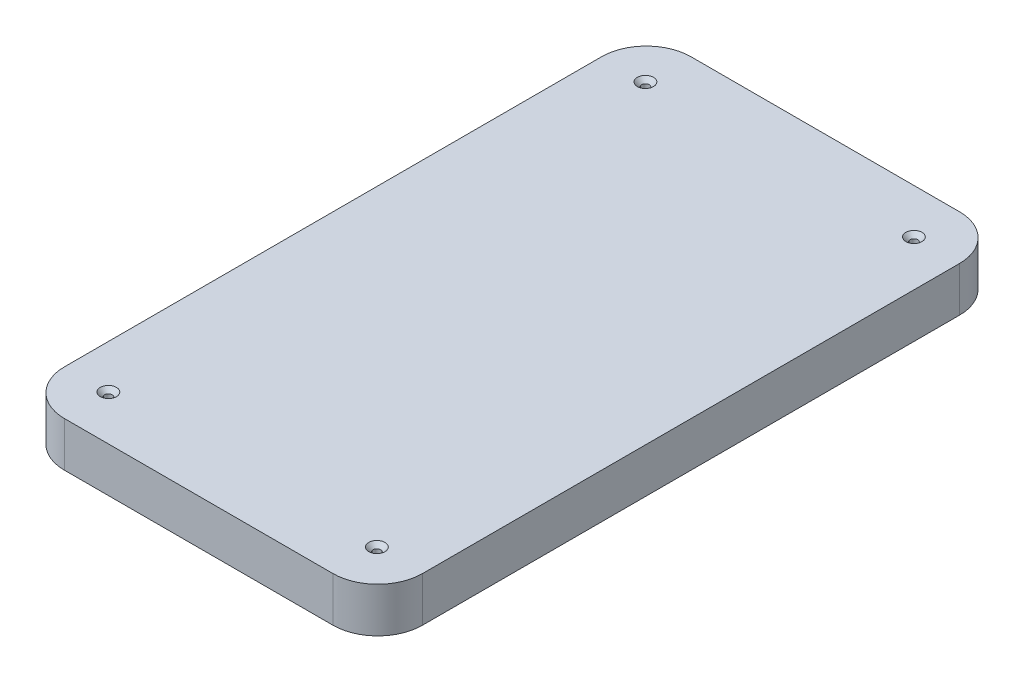
ISO-10303-21;
HEADER;
FILE_DESCRIPTION(('STEP AP214'),'2;1');
FILE_NAME('part.step','',(''),(''),'','','');
FILE_SCHEMA(('AUTOMOTIVE_DESIGN { 1 0 10303 214 1 1 1 1 }'));
ENDSEC;
DATA;
#1=APPLICATION_CONTEXT('core data for automotive mechanical design processes');
#2=APPLICATION_PROTOCOL_DEFINITION('international standard','automotive_design',2000,#1);
#3=PRODUCT_CONTEXT('',#1,'mechanical');
#4=PRODUCT('Part','Part','',(#3));
#5=PRODUCT_RELATED_PRODUCT_CATEGORY('part','',(#4));
#6=PRODUCT_DEFINITION_FORMATION('','',#4);
#7=PRODUCT_DEFINITION_CONTEXT('part definition',#1,'design');
#8=PRODUCT_DEFINITION('design','',#6,#7);
#9=PRODUCT_DEFINITION_SHAPE('','',#8);
#10=(LENGTH_UNIT() NAMED_UNIT(*) SI_UNIT(.MILLI.,.METRE.));
#11=(NAMED_UNIT(*) PLANE_ANGLE_UNIT() SI_UNIT($,.RADIAN.));
#12=(NAMED_UNIT(*) SI_UNIT($,.STERADIAN.) SOLID_ANGLE_UNIT());
#13=UNCERTAINTY_MEASURE_WITH_UNIT(LENGTH_MEASURE(1.E-05),#10,'distance_accuracy_value','');
#14=(GEOMETRIC_REPRESENTATION_CONTEXT(3) GLOBAL_UNCERTAINTY_ASSIGNED_CONTEXT((#13)) GLOBAL_UNIT_ASSIGNED_CONTEXT((#10,
#11,#12)) REPRESENTATION_CONTEXT('',''));
#15=CARTESIAN_POINT('',(0.,0.,0.));
#16=DIRECTION('',(0.,0.,1.));
#17=DIRECTION('',(1.,0.,0.));
#18=AXIS2_PLACEMENT_3D('',#15,#16,#17);
#19=CARTESIAN_POINT('',(0.,0.,0.));
#20=DIRECTION('',(0.,-1.,0.));
#21=DIRECTION('',(0.,0.,-1.));
#22=AXIS2_PLACEMENT_3D('',#19,#20,#21);
#23=PLANE('',#22);
#24=CARTESIAN_POINT('',(-30.2163328764187,0.,-60.0284298133967));
#25=DIRECTION('',(0.,1.,0.));
#26=DIRECTION('',(0.,0.,1.));
#27=AXIS2_PLACEMENT_3D('',#24,#25,#26);
#28=CIRCLE('',#27,0.849999999999986);
#29=CARTESIAN_POINT('',(-30.2163328764187,0.,-59.1784298133967));
#30=VERTEX_POINT('',#29);
#31=EDGE_CURVE('E793',#30,#30,#28,.T.);
#32=ORIENTED_EDGE('',*,*,#31,.T.);
#33=EDGE_LOOP('',(#32));
#34=FACE_BOUND('',#33,.T.);
#35=CARTESIAN_POINT('',(29.7723509773767,0.,-60.0284298133967));
#36=DIRECTION('',(0.,1.,0.));
#37=DIRECTION('',(0.,0.,1.));
#38=AXIS2_PLACEMENT_3D('',#35,#36,#37);
#39=CIRCLE('',#38,0.849999999999986);
#40=CARTESIAN_POINT('',(29.7723509773767,0.,-59.1784298133967));
#41=VERTEX_POINT('',#40);
#42=EDGE_CURVE('E806',#41,#41,#39,.T.);
#43=ORIENTED_EDGE('',*,*,#42,.T.);
#44=EDGE_LOOP('',(#43));
#45=FACE_BOUND('',#44,.T.);
#46=CARTESIAN_POINT('',(29.7723509773767,0.,59.9579094354149));
#47=DIRECTION('',(0.,1.,0.));
#48=DIRECTION('',(0.,0.,1.));
#49=AXIS2_PLACEMENT_3D('',#46,#47,#48);
#50=CIRCLE('',#49,0.849999999999986);
#51=CARTESIAN_POINT('',(29.7723509773767,0.,60.8079094354149));
#52=VERTEX_POINT('',#51);
#53=EDGE_CURVE('E818',#52,#52,#50,.T.);
#54=ORIENTED_EDGE('',*,*,#53,.T.);
#55=EDGE_LOOP('',(#54));
#56=FACE_BOUND('',#55,.T.);
#57=DIRECTION('',(0.,0.,1.));
#58=VECTOR('',#57,1.);
#59=CARTESIAN_POINT('',(-40.,0.,70.));
#60=LINE('',#59,#58);
#61=CARTESIAN_POINT('',(-40.,0.,-60.));
#62=VERTEX_POINT('',#61);
#63=CARTESIAN_POINT('',(-40.,0.,60.));
#64=VERTEX_POINT('',#63);
#65=EDGE_CURVE('E403',#62,#64,#60,.T.);
#66=ORIENTED_EDGE('',*,*,#65,.F.);
#67=CARTESIAN_POINT('',(-30.,0.,-60.));
#68=DIRECTION('',(0.,-1.,0.));
#69=DIRECTION('',(0.,0.,-1.));
#70=AXIS2_PLACEMENT_3D('',#67,#68,#69);
#71=CIRCLE('',#70,10.);
#72=CARTESIAN_POINT('',(-30.,0.,-70.));
#73=VERTEX_POINT('',#72);
#74=EDGE_CURVE('E424',#62,#73,#71,.T.);
#75=ORIENTED_EDGE('',*,*,#74,.T.);
#76=DIRECTION('',(-1.,0.,0.));
#77=VECTOR('',#76,1.);
#78=CARTESIAN_POINT('',(-40.,0.,-70.));
#79=LINE('',#78,#77);
#80=CARTESIAN_POINT('',(30.,0.,-70.));
#81=VERTEX_POINT('',#80);
#82=EDGE_CURVE('E399',#81,#73,#79,.T.);
#83=ORIENTED_EDGE('',*,*,#82,.F.);
#84=CARTESIAN_POINT('',(30.,0.,-60.));
#85=DIRECTION('',(0.,-1.,0.));
#86=DIRECTION('',(0.,0.,-1.));
#87=AXIS2_PLACEMENT_3D('',#84,#85,#86);
#88=CIRCLE('',#87,10.);
#89=CARTESIAN_POINT('',(40.,0.,-60.));
#90=VERTEX_POINT('',#89);
#91=EDGE_CURVE('E415',#81,#90,#88,.T.);
#92=ORIENTED_EDGE('',*,*,#91,.T.);
#93=DIRECTION('',(0.,0.,-1.));
#94=VECTOR('',#93,1.);
#95=CARTESIAN_POINT('',(40.,0.,70.));
#96=LINE('',#95,#94);
#97=CARTESIAN_POINT('',(40.,0.,60.));
#98=VERTEX_POINT('',#97);
#99=EDGE_CURVE('E366',#98,#90,#96,.T.);
#100=ORIENTED_EDGE('',*,*,#99,.F.);
#101=CARTESIAN_POINT('',(30.,0.,60.));
#102=DIRECTION('',(0.,-1.,0.));
#103=DIRECTION('',(0.,0.,-1.));
#104=AXIS2_PLACEMENT_3D('',#101,#102,#103);
#105=CIRCLE('',#104,10.);
#106=CARTESIAN_POINT('',(30.,0.,70.));
#107=VERTEX_POINT('',#106);
#108=EDGE_CURVE('E418',#98,#107,#105,.T.);
#109=ORIENTED_EDGE('',*,*,#108,.T.);
#110=DIRECTION('',(1.,0.,0.));
#111=VECTOR('',#110,1.);
#112=CARTESIAN_POINT('',(-40.,0.,70.));
#113=LINE('',#112,#111);
#114=CARTESIAN_POINT('',(-30.,0.,70.));
#115=VERTEX_POINT('',#114);
#116=EDGE_CURVE('E385',#115,#107,#113,.T.);
#117=ORIENTED_EDGE('',*,*,#116,.F.);
#118=CARTESIAN_POINT('',(-30.,0.,60.));
#119=DIRECTION('',(0.,-1.,0.));
#120=DIRECTION('',(0.,0.,-1.));
#121=AXIS2_PLACEMENT_3D('',#118,#119,#120);
#122=CIRCLE('',#121,10.);
#123=EDGE_CURVE('E421',#115,#64,#122,.T.);
#124=ORIENTED_EDGE('',*,*,#123,.T.);
#125=EDGE_LOOP('',(#66,#75,#83,#92,#100,#109,#117,#124));
#126=FACE_BOUND('',#125,.T.);
#127=DIRECTION('',(-1.,0.,0.));
#128=VECTOR('',#127,1.);
#129=CARTESIAN_POINT('',(0.,0.,-65.));
#130=LINE('',#129,#128);
#131=CARTESIAN_POINT('',(25.,0.,-65.));
#132=VERTEX_POINT('',#131);
#133=CARTESIAN_POINT('',(-25.,0.,-65.));
#134=VERTEX_POINT('',#133);
#135=EDGE_CURVE('E370',#132,#134,#130,.T.);
#136=ORIENTED_EDGE('',*,*,#135,.T.);
#137=DIRECTION('',(0.,0.,1.));
#138=VECTOR('',#137,1.);
#139=CARTESIAN_POINT('',(-25.,0.,-60.));
#140=LINE('',#139,#138);
#141=CARTESIAN_POINT('',(-25.,0.,-60.));
#142=VERTEX_POINT('',#141);
#143=EDGE_CURVE('E834',#134,#142,#140,.T.);
#144=ORIENTED_EDGE('',*,*,#143,.T.);
#145=CARTESIAN_POINT('',(-30.,0.,-60.));
#146=DIRECTION('',(0.,-1.,0.));
#147=DIRECTION('',(0.,0.,1.));
#148=AXIS2_PLACEMENT_3D('',#145,#146,#147);
#149=CIRCLE('',#148,5.);
#150=CARTESIAN_POINT('',(-30.,0.,-55.));
#151=VERTEX_POINT('',#150);
#152=EDGE_CURVE('E281',#142,#151,#149,.T.);
#153=ORIENTED_EDGE('',*,*,#152,.T.);
#154=DIRECTION('',(-1.,0.,0.));
#155=VECTOR('',#154,1.);
#156=CARTESIAN_POINT('',(-35.,0.,-55.));
#157=LINE('',#156,#155);
#158=CARTESIAN_POINT('',(-35.,0.,-55.));
#159=VERTEX_POINT('',#158);
#160=EDGE_CURVE('E228',#151,#159,#157,.T.);
#161=ORIENTED_EDGE('',*,*,#160,.T.);
#162=DIRECTION('',(0.,0.,1.));
#163=VECTOR('',#162,1.);
#164=CARTESIAN_POINT('',(-35.,0.,0.));
#165=LINE('',#164,#163);
#166=CARTESIAN_POINT('',(-35.,0.,55.));
#167=VERTEX_POINT('',#166);
#168=EDGE_CURVE('E374',#159,#167,#165,.T.);
#169=ORIENTED_EDGE('',*,*,#168,.T.);
#170=DIRECTION('',(1.,0.,0.));
#171=VECTOR('',#170,1.);
#172=CARTESIAN_POINT('',(-30.,0.,55.));
#173=LINE('',#172,#171);
#174=CARTESIAN_POINT('',(-30.,0.,55.));
#175=VERTEX_POINT('',#174);
#176=EDGE_CURVE('E321',#167,#175,#173,.T.);
#177=ORIENTED_EDGE('',*,*,#176,.T.);
#178=CARTESIAN_POINT('',(-30.,0.,60.));
#179=DIRECTION('',(0.,-1.,0.));
#180=DIRECTION('',(0.,0.,-1.));
#181=AXIS2_PLACEMENT_3D('',#178,#179,#180);
#182=CIRCLE('',#181,5.00000000000001);
#183=CARTESIAN_POINT('',(-25.,0.,60.));
#184=VERTEX_POINT('',#183);
#185=EDGE_CURVE('E320',#175,#184,#182,.T.);
#186=ORIENTED_EDGE('',*,*,#185,.T.);
#187=DIRECTION('',(0.,0.,1.));
#188=VECTOR('',#187,1.);
#189=CARTESIAN_POINT('',(-25.,0.,65.));
#190=LINE('',#189,#188);
#191=CARTESIAN_POINT('',(-25.,0.,65.));
#192=VERTEX_POINT('',#191);
#193=EDGE_CURVE('E316',#184,#192,#190,.T.);
#194=ORIENTED_EDGE('',*,*,#193,.T.);
#195=DIRECTION('',(1.,0.,0.));
#196=VECTOR('',#195,1.);
#197=CARTESIAN_POINT('',(0.,0.,65.));
#198=LINE('',#197,#196);
#199=CARTESIAN_POINT('',(25.,0.,65.));
#200=VERTEX_POINT('',#199);
#201=EDGE_CURVE('E356',#192,#200,#198,.T.);
#202=ORIENTED_EDGE('',*,*,#201,.T.);
#203=DIRECTION('',(0.,0.,-1.));
#204=VECTOR('',#203,1.);
#205=CARTESIAN_POINT('',(25.,0.,60.));
#206=LINE('',#205,#204);
#207=CARTESIAN_POINT('',(25.,0.,60.));
#208=VERTEX_POINT('',#207);
#209=EDGE_CURVE('E287',#200,#208,#206,.T.);
#210=ORIENTED_EDGE('',*,*,#209,.T.);
#211=CARTESIAN_POINT('',(30.,0.,60.));
#212=DIRECTION('',(0.,-1.,0.));
#213=DIRECTION('',(0.,0.,-1.));
#214=AXIS2_PLACEMENT_3D('',#211,#212,#213);
#215=CIRCLE('',#214,5.);
#216=CARTESIAN_POINT('',(30.,0.,55.));
#217=VERTEX_POINT('',#216);
#218=EDGE_CURVE('E286',#208,#217,#215,.T.);
#219=ORIENTED_EDGE('',*,*,#218,.T.);
#220=DIRECTION('',(1.,0.,0.));
#221=VECTOR('',#220,1.);
#222=CARTESIAN_POINT('',(35.,0.,55.));
#223=LINE('',#222,#221);
#224=CARTESIAN_POINT('',(35.,0.,55.));
#225=VERTEX_POINT('',#224);
#226=EDGE_CURVE('E282',#217,#225,#223,.T.);
#227=ORIENTED_EDGE('',*,*,#226,.T.);
#228=DIRECTION('',(0.,0.,-1.));
#229=VECTOR('',#228,1.);
#230=CARTESIAN_POINT('',(35.,0.,0.));
#231=LINE('',#230,#229);
#232=CARTESIAN_POINT('',(35.,0.,-55.));
#233=VERTEX_POINT('',#232);
#234=EDGE_CURVE('E329',#225,#233,#231,.T.);
#235=ORIENTED_EDGE('',*,*,#234,.T.);
#236=DIRECTION('',(-1.,0.,0.));
#237=VECTOR('',#236,1.);
#238=CARTESIAN_POINT('',(30.,0.,-55.));
#239=LINE('',#238,#237);
#240=CARTESIAN_POINT('',(30.,0.,-55.));
#241=VERTEX_POINT('',#240);
#242=EDGE_CURVE('E251',#233,#241,#239,.T.);
#243=ORIENTED_EDGE('',*,*,#242,.T.);
#244=CARTESIAN_POINT('',(30.,0.,-60.));
#245=DIRECTION('',(0.,-1.,0.));
#246=DIRECTION('',(0.,0.,1.));
#247=AXIS2_PLACEMENT_3D('',#244,#245,#246);
#248=CIRCLE('',#247,5.);
#249=CARTESIAN_POINT('',(25.,0.,-60.));
#250=VERTEX_POINT('',#249);
#251=EDGE_CURVE('E246',#241,#250,#248,.T.);
#252=ORIENTED_EDGE('',*,*,#251,.T.);
#253=DIRECTION('',(0.,0.,-1.));
#254=VECTOR('',#253,1.);
#255=CARTESIAN_POINT('',(25.,0.,-65.));
#256=LINE('',#255,#254);
#257=EDGE_CURVE('E255',#250,#132,#256,.T.);
#258=ORIENTED_EDGE('',*,*,#257,.T.);
#259=EDGE_LOOP('',(#136,#144,#153,#161,#169,#177,#186,#194,#202,#210,#219,#227,#235,#243,#252,#258));
#260=FACE_BOUND('',#259,.T.);
#261=CARTESIAN_POINT('',(-30.2163328764187,0.,59.9579094354149));
#262=DIRECTION('',(0.,1.,0.));
#263=DIRECTION('',(0.,0.,1.));
#264=AXIS2_PLACEMENT_3D('',#261,#262,#263);
#265=CIRCLE('',#264,0.849999999999986);
#266=CARTESIAN_POINT('',(-30.2163328764187,0.,60.8079094354149));
#267=VERTEX_POINT('',#266);
#268=EDGE_CURVE('E245',#267,#267,#265,.T.);
#269=ORIENTED_EDGE('',*,*,#268,.T.);
#270=EDGE_LOOP('',(#269));
#271=FACE_BOUND('',#270,.T.);
#272=ADVANCED_FACE('F40',(#34,#45,#56,#126,#260,#271),#23,.T.);
#273=CARTESIAN_POINT('',(40.,10.,70.));
#274=DIRECTION('',(-1.,0.,0.));
#275=DIRECTION('',(0.,0.,1.));
#276=AXIS2_PLACEMENT_3D('',#273,#274,#275);
#277=PLANE('',#276);
#278=DIRECTION('',(0.,0.,-1.));
#279=VECTOR('',#278,1.);
#280=CARTESIAN_POINT('',(40.,10.,70.));
#281=LINE('',#280,#279);
#282=CARTESIAN_POINT('',(40.,10.,60.));
#283=VERTEX_POINT('',#282);
#284=CARTESIAN_POINT('',(40.,10.,-60.));
#285=VERTEX_POINT('',#284);
#286=EDGE_CURVE('E380',#283,#285,#281,.T.);
#287=ORIENTED_EDGE('',*,*,#286,.F.);
#288=DIRECTION('',(0.,-1.,0.));
#289=VECTOR('',#288,1.);
#290=CARTESIAN_POINT('',(40.,10.,60.));
#291=LINE('',#290,#289);
#292=EDGE_CURVE('E11',#283,#98,#291,.T.);
#293=ORIENTED_EDGE('',*,*,#292,.T.);
#294=ORIENTED_EDGE('',*,*,#99,.T.);
#295=DIRECTION('',(0.,-1.,0.));
#296=VECTOR('',#295,1.);
#297=CARTESIAN_POINT('',(40.,10.,-60.));
#298=LINE('',#297,#296);
#299=EDGE_CURVE('E49',#90,#285,#298,.F.);
#300=ORIENTED_EDGE('',*,*,#299,.T.);
#301=EDGE_LOOP('',(#287,#293,#294,#300));
#302=FACE_BOUND('',#301,.T.);
#303=ADVANCED_FACE('F454',(#302),#277,.F.);
#304=CARTESIAN_POINT('',(-40.,10.,-70.));
#305=DIRECTION('',(0.,0.,1.));
#306=DIRECTION('',(1.,0.,0.));
#307=AXIS2_PLACEMENT_3D('',#304,#305,#306);
#308=PLANE('',#307);
#309=ORIENTED_EDGE('',*,*,#82,.T.);
#310=DIRECTION('',(0.,-1.,0.));
#311=VECTOR('',#310,1.);
#312=CARTESIAN_POINT('',(-30.,10.,-70.));
#313=LINE('',#312,#311);
#314=CARTESIAN_POINT('',(-30.,10.,-70.));
#315=VERTEX_POINT('',#314);
#316=EDGE_CURVE('E431',#73,#315,#313,.F.);
#317=ORIENTED_EDGE('',*,*,#316,.T.);
#318=DIRECTION('',(-1.,0.,0.));
#319=VECTOR('',#318,1.);
#320=CARTESIAN_POINT('',(-40.,10.,-70.));
#321=LINE('',#320,#319);
#322=CARTESIAN_POINT('',(30.,10.,-70.));
#323=VERTEX_POINT('',#322);
#324=EDGE_CURVE('E384',#323,#315,#321,.T.);
#325=ORIENTED_EDGE('',*,*,#324,.F.);
#326=DIRECTION('',(0.,-1.,0.));
#327=VECTOR('',#326,1.);
#328=CARTESIAN_POINT('',(30.,10.,-70.));
#329=LINE('',#328,#327);
#330=EDGE_CURVE('E427',#323,#81,#329,.T.);
#331=ORIENTED_EDGE('',*,*,#330,.T.);
#332=EDGE_LOOP('',(#309,#317,#325,#331));
#333=FACE_BOUND('',#332,.T.);
#334=ADVANCED_FACE('F465',(#333),#308,.F.);
#335=CARTESIAN_POINT('',(-40.,10.,70.));
#336=DIRECTION('',(1.,0.,0.));
#337=DIRECTION('',(0.,0.,-1.));
#338=AXIS2_PLACEMENT_3D('',#335,#336,#337);
#339=PLANE('',#338);
#340=DIRECTION('',(0.,0.,1.));
#341=VECTOR('',#340,1.);
#342=CARTESIAN_POINT('',(-40.,10.,70.));
#343=LINE('',#342,#341);
#344=CARTESIAN_POINT('',(-40.,10.,-60.));
#345=VERTEX_POINT('',#344);
#346=CARTESIAN_POINT('',(-40.,10.,60.));
#347=VERTEX_POINT('',#346);
#348=EDGE_CURVE('E389',#345,#347,#343,.T.);
#349=ORIENTED_EDGE('',*,*,#348,.F.);
#350=DIRECTION('',(0.,-1.,0.));
#351=VECTOR('',#350,1.);
#352=CARTESIAN_POINT('',(-40.,10.,-60.));
#353=LINE('',#352,#351);
#354=EDGE_CURVE('E411',#345,#62,#353,.T.);
#355=ORIENTED_EDGE('',*,*,#354,.T.);
#356=ORIENTED_EDGE('',*,*,#65,.T.);
#357=DIRECTION('',(0.,-1.,0.));
#358=VECTOR('',#357,1.);
#359=CARTESIAN_POINT('',(-40.,10.,60.));
#360=LINE('',#359,#358);
#361=EDGE_CURVE('E395',#64,#347,#360,.F.);
#362=ORIENTED_EDGE('',*,*,#361,.T.);
#363=EDGE_LOOP('',(#349,#355,#356,#362));
#364=FACE_BOUND('',#363,.T.);
#365=ADVANCED_FACE('F476',(#364),#339,.F.);
#366=CARTESIAN_POINT('',(-40.,10.,70.));
#367=DIRECTION('',(0.,0.,-1.));
#368=DIRECTION('',(-1.,0.,0.));
#369=AXIS2_PLACEMENT_3D('',#366,#367,#368);
#370=PLANE('',#369);
#371=DIRECTION('',(1.,0.,0.));
#372=VECTOR('',#371,1.);
#373=CARTESIAN_POINT('',(-40.,10.,70.));
#374=LINE('',#373,#372);
#375=CARTESIAN_POINT('',(-30.,10.,70.));
#376=VERTEX_POINT('',#375);
#377=CARTESIAN_POINT('',(30.,10.,70.));
#378=VERTEX_POINT('',#377);
#379=EDGE_CURVE('E392',#376,#378,#374,.T.);
#380=ORIENTED_EDGE('',*,*,#379,.F.);
#381=DIRECTION('',(0.,-1.,0.));
#382=VECTOR('',#381,1.);
#383=CARTESIAN_POINT('',(-30.,10.,70.));
#384=LINE('',#383,#382);
#385=EDGE_CURVE('E447',#376,#115,#384,.T.);
#386=ORIENTED_EDGE('',*,*,#385,.T.);
#387=ORIENTED_EDGE('',*,*,#116,.T.);
#388=DIRECTION('',(0.,-1.,0.));
#389=VECTOR('',#388,1.);
#390=CARTESIAN_POINT('',(30.,10.,70.));
#391=LINE('',#390,#389);
#392=EDGE_CURVE('E56',#107,#378,#391,.F.);
#393=ORIENTED_EDGE('',*,*,#392,.T.);
#394=EDGE_LOOP('',(#380,#386,#387,#393));
#395=FACE_BOUND('',#394,.T.);
#396=ADVANCED_FACE('F482',(#395),#370,.F.);
#397=CARTESIAN_POINT('',(0.,10.,0.));
#398=DIRECTION('',(0.,-1.,0.));
#399=DIRECTION('',(0.,0.,-1.));
#400=AXIS2_PLACEMENT_3D('',#397,#398,#399);
#401=PLANE('',#400);
#402=CARTESIAN_POINT('',(-30.2163328764187,10.,-60.0284298133967));
#403=DIRECTION('',(0.,1.,0.));
#404=DIRECTION('',(0.,0.,1.));
#405=AXIS2_PLACEMENT_3D('',#402,#403,#404);
#406=CIRCLE('',#405,1.8);
#407=CARTESIAN_POINT('',(-30.2163328764187,10.,-58.2284298133967));
#408=VERTEX_POINT('',#407);
#409=EDGE_CURVE('E788',#408,#408,#406,.T.);
#410=ORIENTED_EDGE('',*,*,#409,.F.);
#411=EDGE_LOOP('',(#410));
#412=FACE_BOUND('',#411,.T.);
#413=CARTESIAN_POINT('',(29.7723509773767,10.,-60.0284298133967));
#414=DIRECTION('',(0.,1.,0.));
#415=DIRECTION('',(0.,0.,1.));
#416=AXIS2_PLACEMENT_3D('',#413,#414,#415);
#417=CIRCLE('',#416,1.8);
#418=CARTESIAN_POINT('',(29.7723509773767,10.,-58.2284298133967));
#419=VERTEX_POINT('',#418);
#420=EDGE_CURVE('E798',#419,#419,#417,.T.);
#421=ORIENTED_EDGE('',*,*,#420,.F.);
#422=EDGE_LOOP('',(#421));
#423=FACE_BOUND('',#422,.T.);
#424=CARTESIAN_POINT('',(29.7723509773767,10.,59.9579094354149));
#425=DIRECTION('',(0.,1.,0.));
#426=DIRECTION('',(0.,0.,1.));
#427=AXIS2_PLACEMENT_3D('',#424,#425,#426);
#428=CIRCLE('',#427,1.8);
#429=CARTESIAN_POINT('',(29.7723509773767,10.,61.7579094354149));
#430=VERTEX_POINT('',#429);
#431=EDGE_CURVE('E810',#430,#430,#428,.T.);
#432=ORIENTED_EDGE('',*,*,#431,.F.);
#433=EDGE_LOOP('',(#432));
#434=FACE_BOUND('',#433,.T.);
#435=CARTESIAN_POINT('',(-30.2163328764187,10.,59.9579094354149));
#436=DIRECTION('',(0.,1.,0.));
#437=DIRECTION('',(0.,0.,1.));
#438=AXIS2_PLACEMENT_3D('',#435,#436,#437);
#439=CIRCLE('',#438,1.8);
#440=CARTESIAN_POINT('',(-30.2163328764187,10.,61.7579094354149));
#441=VERTEX_POINT('',#440);
#442=EDGE_CURVE('E822',#441,#441,#439,.T.);
#443=ORIENTED_EDGE('',*,*,#442,.F.);
#444=EDGE_LOOP('',(#443));
#445=FACE_BOUND('',#444,.T.);
#446=ORIENTED_EDGE('',*,*,#324,.T.);
#447=CARTESIAN_POINT('',(-30.,10.,-60.));
#448=DIRECTION('',(0.,-1.,0.));
#449=DIRECTION('',(0.,0.,-1.));
#450=AXIS2_PLACEMENT_3D('',#447,#448,#449);
#451=CIRCLE('',#450,10.);
#452=EDGE_CURVE('E442',#315,#345,#451,.F.);
#453=ORIENTED_EDGE('',*,*,#452,.T.);
#454=ORIENTED_EDGE('',*,*,#348,.T.);
#455=CARTESIAN_POINT('',(-30.,10.,60.));
#456=DIRECTION('',(0.,-1.,0.));
#457=DIRECTION('',(0.,0.,-1.));
#458=AXIS2_PLACEMENT_3D('',#455,#456,#457);
#459=CIRCLE('',#458,10.);
#460=EDGE_CURVE('E63',#347,#376,#459,.F.);
#461=ORIENTED_EDGE('',*,*,#460,.T.);
#462=ORIENTED_EDGE('',*,*,#379,.T.);
#463=CARTESIAN_POINT('',(30.,10.,60.));
#464=DIRECTION('',(0.,-1.,0.));
#465=DIRECTION('',(0.,0.,-1.));
#466=AXIS2_PLACEMENT_3D('',#463,#464,#465);
#467=CIRCLE('',#466,10.);
#468=EDGE_CURVE('E437',#378,#283,#467,.F.);
#469=ORIENTED_EDGE('',*,*,#468,.T.);
#470=ORIENTED_EDGE('',*,*,#286,.T.);
#471=CARTESIAN_POINT('',(30.,10.,-60.));
#472=DIRECTION('',(0.,-1.,0.));
#473=DIRECTION('',(0.,0.,-1.));
#474=AXIS2_PLACEMENT_3D('',#471,#472,#473);
#475=CIRCLE('',#474,10.);
#476=EDGE_CURVE('E434',#285,#323,#475,.F.);
#477=ORIENTED_EDGE('',*,*,#476,.T.);
#478=EDGE_LOOP('',(#446,#453,#454,#461,#462,#469,#470,#477));
#479=FACE_BOUND('',#478,.T.);
#480=ADVANCED_FACE('F459',(#412,#423,#434,#445,#479),#401,.F.);
#481=CARTESIAN_POINT('',(35.,10.,70.));
#482=DIRECTION('',(-1.,0.,0.));
#483=DIRECTION('',(0.,0.,1.));
#484=AXIS2_PLACEMENT_3D('',#481,#482,#483);
#485=PLANE('',#484);
#486=DIRECTION('',(0.,-1.,0.));
#487=VECTOR('',#486,1.);
#488=CARTESIAN_POINT('',(35.,10.002,-55.));
#489=LINE('',#488,#487);
#490=CARTESIAN_POINT('',(35.,5.,-55.));
#491=VERTEX_POINT('',#490);
#492=EDGE_CURVE('E268',#491,#233,#489,.T.);
#493=ORIENTED_EDGE('',*,*,#492,.T.);
#494=ORIENTED_EDGE('',*,*,#234,.F.);
#495=DIRECTION('',(0.,-1.,0.));
#496=VECTOR('',#495,1.);
#497=CARTESIAN_POINT('',(35.,10.002,55.));
#498=LINE('',#497,#496);
#499=CARTESIAN_POINT('',(35.,5.,55.));
#500=VERTEX_POINT('',#499);
#501=EDGE_CURVE('E299',#500,#225,#498,.T.);
#502=ORIENTED_EDGE('',*,*,#501,.F.);
#503=DIRECTION('',(0.,0.,-1.));
#504=VECTOR('',#503,1.);
#505=CARTESIAN_POINT('',(35.,5.,0.));
#506=LINE('',#505,#504);
#507=EDGE_CURVE('E351',#500,#491,#506,.T.);
#508=ORIENTED_EDGE('',*,*,#507,.T.);
#509=EDGE_LOOP('',(#493,#494,#502,#508));
#510=FACE_BOUND('',#509,.T.);
#511=ADVANCED_FACE('F562',(#510),#485,.T.);
#512=CARTESIAN_POINT('',(-40.,10.,-65.));
#513=DIRECTION('',(0.,0.,1.));
#514=DIRECTION('',(1.,0.,0.));
#515=AXIS2_PLACEMENT_3D('',#512,#513,#514);
#516=PLANE('',#515);
#517=DIRECTION('',(0.,-1.,0.));
#518=VECTOR('',#517,1.);
#519=CARTESIAN_POINT('',(-25.,10.002,-65.));
#520=LINE('',#519,#518);
#521=CARTESIAN_POINT('',(-25.,5.,-65.));
#522=VERTEX_POINT('',#521);
#523=EDGE_CURVE('E234',#522,#134,#520,.T.);
#524=ORIENTED_EDGE('',*,*,#523,.T.);
#525=ORIENTED_EDGE('',*,*,#135,.F.);
#526=DIRECTION('',(0.,-1.,0.));
#527=VECTOR('',#526,1.);
#528=CARTESIAN_POINT('',(25.,10.002,-65.));
#529=LINE('',#528,#527);
#530=CARTESIAN_POINT('',(25.,5.,-65.));
#531=VERTEX_POINT('',#530);
#532=EDGE_CURVE('E263',#531,#132,#529,.T.);
#533=ORIENTED_EDGE('',*,*,#532,.F.);
#534=DIRECTION('',(-1.,0.,0.));
#535=VECTOR('',#534,1.);
#536=CARTESIAN_POINT('',(0.,5.,-65.));
#537=LINE('',#536,#535);
#538=EDGE_CURVE('E355',#531,#522,#537,.T.);
#539=ORIENTED_EDGE('',*,*,#538,.T.);
#540=EDGE_LOOP('',(#524,#525,#533,#539));
#541=FACE_BOUND('',#540,.T.);
#542=ADVANCED_FACE('F565',(#541),#516,.T.);
#543=CARTESIAN_POINT('',(-35.,10.,70.));
#544=DIRECTION('',(1.,0.,0.));
#545=DIRECTION('',(0.,0.,-1.));
#546=AXIS2_PLACEMENT_3D('',#543,#544,#545);
#547=PLANE('',#546);
#548=DIRECTION('',(0.,-1.,0.));
#549=VECTOR('',#548,1.);
#550=CARTESIAN_POINT('',(-35.,10.002,-55.));
#551=LINE('',#550,#549);
#552=CARTESIAN_POINT('',(-35.,5.,-55.));
#553=VERTEX_POINT('',#552);
#554=EDGE_CURVE('E231',#553,#159,#551,.T.);
#555=ORIENTED_EDGE('',*,*,#554,.F.);
#556=DIRECTION('',(0.,0.,1.));
#557=VECTOR('',#556,1.);
#558=CARTESIAN_POINT('',(-35.,5.,0.));
#559=LINE('',#558,#557);
#560=CARTESIAN_POINT('',(-35.,5.,55.));
#561=VERTEX_POINT('',#560);
#562=EDGE_CURVE('E210',#553,#561,#559,.T.);
#563=ORIENTED_EDGE('',*,*,#562,.T.);
#564=DIRECTION('',(0.,-1.,0.));
#565=VECTOR('',#564,1.);
#566=CARTESIAN_POINT('',(-35.,10.002,55.));
#567=LINE('',#566,#565);
#568=EDGE_CURVE('E338',#561,#167,#567,.T.);
#569=ORIENTED_EDGE('',*,*,#568,.T.);
#570=ORIENTED_EDGE('',*,*,#168,.F.);
#571=EDGE_LOOP('',(#555,#563,#569,#570));
#572=FACE_BOUND('',#571,.T.);
#573=ADVANCED_FACE('F569',(#572),#547,.T.);
#574=CARTESIAN_POINT('',(-40.,10.,65.));
#575=DIRECTION('',(0.,0.,-1.));
#576=DIRECTION('',(-1.,0.,0.));
#577=AXIS2_PLACEMENT_3D('',#574,#575,#576);
#578=PLANE('',#577);
#579=DIRECTION('',(0.,-1.,0.));
#580=VECTOR('',#579,1.);
#581=CARTESIAN_POINT('',(25.,10.002,65.));
#582=LINE('',#581,#580);
#583=CARTESIAN_POINT('',(25.,5.,65.));
#584=VERTEX_POINT('',#583);
#585=EDGE_CURVE('E304',#584,#200,#582,.T.);
#586=ORIENTED_EDGE('',*,*,#585,.T.);
#587=ORIENTED_EDGE('',*,*,#201,.F.);
#588=DIRECTION('',(0.,-1.,0.));
#589=VECTOR('',#588,1.);
#590=CARTESIAN_POINT('',(-25.,10.002,65.));
#591=LINE('',#590,#589);
#592=CARTESIAN_POINT('',(-25.,5.,65.));
#593=VERTEX_POINT('',#592);
#594=EDGE_CURVE('E333',#593,#192,#591,.T.);
#595=ORIENTED_EDGE('',*,*,#594,.F.);
#596=DIRECTION('',(1.,0.,0.));
#597=VECTOR('',#596,1.);
#598=CARTESIAN_POINT('',(0.,5.,65.));
#599=LINE('',#598,#597);
#600=EDGE_CURVE('E362',#593,#584,#599,.T.);
#601=ORIENTED_EDGE('',*,*,#600,.T.);
#602=EDGE_LOOP('',(#586,#587,#595,#601));
#603=FACE_BOUND('',#602,.T.);
#604=ADVANCED_FACE('F573',(#603),#578,.T.);
#605=CARTESIAN_POINT('',(0.,5.,0.));
#606=DIRECTION('',(0.,-1.,0.));
#607=DIRECTION('',(0.,0.,-1.));
#608=AXIS2_PLACEMENT_3D('',#605,#606,#607);
#609=PLANE('',#608);
#610=DIRECTION('',(0.,0.,-1.));
#611=VECTOR('',#610,1.);
#612=CARTESIAN_POINT('',(-25.,5.,-60.));
#613=LINE('',#612,#611);
#614=CARTESIAN_POINT('',(-25.,5.,-60.));
#615=VERTEX_POINT('',#614);
#616=EDGE_CURVE('E215',#615,#522,#613,.T.);
#617=ORIENTED_EDGE('',*,*,#616,.T.);
#618=ORIENTED_EDGE('',*,*,#538,.F.);
#619=DIRECTION('',(0.,0.,1.));
#620=VECTOR('',#619,1.);
#621=CARTESIAN_POINT('',(25.,5.,-65.));
#622=LINE('',#621,#620);
#623=CARTESIAN_POINT('',(25.,5.,-60.));
#624=VERTEX_POINT('',#623);
#625=EDGE_CURVE('E275',#531,#624,#622,.T.);
#626=ORIENTED_EDGE('',*,*,#625,.T.);
#627=CARTESIAN_POINT('',(30.,5.,-60.));
#628=DIRECTION('',(0.,-1.,0.));
#629=DIRECTION('',(0.,0.,-1.));
#630=AXIS2_PLACEMENT_3D('',#627,#628,#629);
#631=CIRCLE('',#630,5.);
#632=CARTESIAN_POINT('',(30.,5.,-55.));
#633=VERTEX_POINT('',#632);
#634=EDGE_CURVE('E264',#624,#633,#631,.F.);
#635=ORIENTED_EDGE('',*,*,#634,.T.);
#636=DIRECTION('',(1.,0.,0.));
#637=VECTOR('',#636,1.);
#638=CARTESIAN_POINT('',(30.,5.,-55.));
#639=LINE('',#638,#637);
#640=EDGE_CURVE('E278',#633,#491,#639,.T.);
#641=ORIENTED_EDGE('',*,*,#640,.T.);
#642=ORIENTED_EDGE('',*,*,#507,.F.);
#643=DIRECTION('',(-1.,0.,0.));
#644=VECTOR('',#643,1.);
#645=CARTESIAN_POINT('',(35.,5.,55.));
#646=LINE('',#645,#644);
#647=CARTESIAN_POINT('',(30.,5.,55.));
#648=VERTEX_POINT('',#647);
#649=EDGE_CURVE('E311',#500,#648,#646,.T.);
#650=ORIENTED_EDGE('',*,*,#649,.T.);
#651=CARTESIAN_POINT('',(30.,5.,60.));
#652=DIRECTION('',(0.,-1.,0.));
#653=DIRECTION('',(0.,0.,-1.));
#654=AXIS2_PLACEMENT_3D('',#651,#652,#653);
#655=CIRCLE('',#654,5.);
#656=CARTESIAN_POINT('',(25.,5.,60.));
#657=VERTEX_POINT('',#656);
#658=EDGE_CURVE('E300',#648,#657,#655,.F.);
#659=ORIENTED_EDGE('',*,*,#658,.T.);
#660=DIRECTION('',(0.,0.,1.));
#661=VECTOR('',#660,1.);
#662=CARTESIAN_POINT('',(25.,5.,60.));
#663=LINE('',#662,#661);
#664=EDGE_CURVE('E250',#657,#584,#663,.T.);
#665=ORIENTED_EDGE('',*,*,#664,.T.);
#666=ORIENTED_EDGE('',*,*,#600,.F.);
#667=DIRECTION('',(0.,0.,-1.));
#668=VECTOR('',#667,1.);
#669=CARTESIAN_POINT('',(-25.,5.,65.));
#670=LINE('',#669,#668);
#671=CARTESIAN_POINT('',(-25.,5.,60.));
#672=VERTEX_POINT('',#671);
#673=EDGE_CURVE('E346',#593,#672,#670,.T.);
#674=ORIENTED_EDGE('',*,*,#673,.T.);
#675=CARTESIAN_POINT('',(-30.,5.,60.));
#676=DIRECTION('',(0.,-1.,0.));
#677=DIRECTION('',(0.,0.,-1.));
#678=AXIS2_PLACEMENT_3D('',#675,#676,#677);
#679=CIRCLE('',#678,5.00000000000001);
#680=CARTESIAN_POINT('',(-30.,5.,55.));
#681=VERTEX_POINT('',#680);
#682=EDGE_CURVE('E334',#672,#681,#679,.F.);
#683=ORIENTED_EDGE('',*,*,#682,.T.);
#684=DIRECTION('',(-1.,0.,0.));
#685=VECTOR('',#684,1.);
#686=CARTESIAN_POINT('',(-30.,5.,55.));
#687=LINE('',#686,#685);
#688=EDGE_CURVE('E295',#681,#561,#687,.T.);
#689=ORIENTED_EDGE('',*,*,#688,.T.);
#690=ORIENTED_EDGE('',*,*,#562,.F.);
#691=DIRECTION('',(1.,0.,0.));
#692=VECTOR('',#691,1.);
#693=CARTESIAN_POINT('',(-35.,5.,-55.));
#694=LINE('',#693,#692);
#695=CARTESIAN_POINT('',(-30.,5.,-55.));
#696=VERTEX_POINT('',#695);
#697=EDGE_CURVE('E204',#553,#696,#694,.T.);
#698=ORIENTED_EDGE('',*,*,#697,.T.);
#699=CARTESIAN_POINT('',(-30.,5.,-60.));
#700=DIRECTION('',(0.,-1.,0.));
#701=DIRECTION('',(0.,0.,-1.));
#702=AXIS2_PLACEMENT_3D('',#699,#700,#701);
#703=CIRCLE('',#702,5.);
#704=EDGE_CURVE('E207',#696,#615,#703,.F.);
#705=ORIENTED_EDGE('',*,*,#704,.T.);
#706=EDGE_LOOP('',(#617,#618,#626,#635,#641,#642,#650,#659,#665,#666,#674,#683,#689,#690,#698,#705));
#707=FACE_BOUND('',#706,.T.);
#708=ADVANCED_FACE('F206',(#707),#609,.T.);
#709=CARTESIAN_POINT('',(-30.,10.002,55.));
#710=DIRECTION('',(0.,0.,-1.));
#711=DIRECTION('',(-1.,0.,0.));
#712=AXIS2_PLACEMENT_3D('',#709,#710,#711);
#713=PLANE('',#712);
#714=ORIENTED_EDGE('',*,*,#688,.F.);
#715=DIRECTION('',(0.,-1.,0.));
#716=VECTOR('',#715,1.);
#717=CARTESIAN_POINT('',(-30.,10.002,55.));
#718=LINE('',#717,#716);
#719=EDGE_CURVE('E325',#681,#175,#718,.T.);
#720=ORIENTED_EDGE('',*,*,#719,.T.);
#721=ORIENTED_EDGE('',*,*,#176,.F.);
#722=ORIENTED_EDGE('',*,*,#568,.F.);
#723=EDGE_LOOP('',(#714,#720,#721,#722));
#724=FACE_BOUND('',#723,.T.);
#725=ADVANCED_FACE('F547',(#724),#713,.T.);
#726=CARTESIAN_POINT('',(-25.,10.002,65.));
#727=DIRECTION('',(1.,0.,0.));
#728=DIRECTION('',(0.,0.,-1.));
#729=AXIS2_PLACEMENT_3D('',#726,#727,#728);
#730=PLANE('',#729);
#731=ORIENTED_EDGE('',*,*,#673,.F.);
#732=ORIENTED_EDGE('',*,*,#594,.T.);
#733=ORIENTED_EDGE('',*,*,#193,.F.);
#734=DIRECTION('',(0.,-1.,0.));
#735=VECTOR('',#734,1.);
#736=CARTESIAN_POINT('',(-25.,10.002,60.));
#737=LINE('',#736,#735);
#738=EDGE_CURVE('E330',#672,#184,#737,.T.);
#739=ORIENTED_EDGE('',*,*,#738,.F.);
#740=EDGE_LOOP('',(#731,#732,#733,#739));
#741=FACE_BOUND('',#740,.T.);
#742=ADVANCED_FACE('F552',(#741),#730,.T.);
#743=CARTESIAN_POINT('',(-30.,10.002,60.));
#744=DIRECTION('',(0.,-1.,0.));
#745=DIRECTION('',(0.,0.,-1.));
#746=AXIS2_PLACEMENT_3D('',#743,#744,#745);
#747=CYLINDRICAL_SURFACE('',#746,5.00000000000001);
#748=ORIENTED_EDGE('',*,*,#682,.F.);
#749=ORIENTED_EDGE('',*,*,#738,.T.);
#750=ORIENTED_EDGE('',*,*,#185,.F.);
#751=ORIENTED_EDGE('',*,*,#719,.F.);
#752=EDGE_LOOP('',(#748,#749,#750,#751));
#753=FACE_BOUND('',#752,.T.);
#754=ADVANCED_FACE('F550',(#753),#747,.T.);
#755=CARTESIAN_POINT('',(25.,10.002,60.));
#756=DIRECTION('',(-1.,0.,0.));
#757=DIRECTION('',(0.,0.,1.));
#758=AXIS2_PLACEMENT_3D('',#755,#756,#757);
#759=PLANE('',#758);
#760=ORIENTED_EDGE('',*,*,#664,.F.);
#761=DIRECTION('',(0.,-1.,0.));
#762=VECTOR('',#761,1.);
#763=CARTESIAN_POINT('',(25.,10.002,60.));
#764=LINE('',#763,#762);
#765=EDGE_CURVE('E291',#657,#208,#764,.T.);
#766=ORIENTED_EDGE('',*,*,#765,.T.);
#767=ORIENTED_EDGE('',*,*,#209,.F.);
#768=ORIENTED_EDGE('',*,*,#585,.F.);
#769=EDGE_LOOP('',(#760,#766,#767,#768));
#770=FACE_BOUND('',#769,.T.);
#771=ADVANCED_FACE('F531',(#770),#759,.T.);
#772=CARTESIAN_POINT('',(35.,10.002,55.));
#773=DIRECTION('',(0.,0.,-1.));
#774=DIRECTION('',(-1.,0.,0.));
#775=AXIS2_PLACEMENT_3D('',#772,#773,#774);
#776=PLANE('',#775);
#777=ORIENTED_EDGE('',*,*,#649,.F.);
#778=ORIENTED_EDGE('',*,*,#501,.T.);
#779=ORIENTED_EDGE('',*,*,#226,.F.);
#780=DIRECTION('',(0.,-1.,0.));
#781=VECTOR('',#780,1.);
#782=CARTESIAN_POINT('',(30.,10.002,55.));
#783=LINE('',#782,#781);
#784=EDGE_CURVE('E296',#648,#217,#783,.T.);
#785=ORIENTED_EDGE('',*,*,#784,.F.);
#786=EDGE_LOOP('',(#777,#778,#779,#785));
#787=FACE_BOUND('',#786,.T.);
#788=ADVANCED_FACE('F540',(#787),#776,.T.);
#789=CARTESIAN_POINT('',(30.,10.002,60.));
#790=DIRECTION('',(0.,-1.,0.));
#791=DIRECTION('',(0.,0.,-1.));
#792=AXIS2_PLACEMENT_3D('',#789,#790,#791);
#793=CYLINDRICAL_SURFACE('',#792,5.);
#794=ORIENTED_EDGE('',*,*,#658,.F.);
#795=ORIENTED_EDGE('',*,*,#784,.T.);
#796=ORIENTED_EDGE('',*,*,#218,.F.);
#797=ORIENTED_EDGE('',*,*,#765,.F.);
#798=EDGE_LOOP('',(#794,#795,#796,#797));
#799=FACE_BOUND('',#798,.T.);
#800=ADVANCED_FACE('F538',(#799),#793,.T.);
#801=CARTESIAN_POINT('',(30.,10.002,-55.));
#802=DIRECTION('',(0.,0.,1.));
#803=DIRECTION('',(1.,0.,0.));
#804=AXIS2_PLACEMENT_3D('',#801,#802,#803);
#805=PLANE('',#804);
#806=ORIENTED_EDGE('',*,*,#640,.F.);
#807=DIRECTION('',(0.,-1.,0.));
#808=VECTOR('',#807,1.);
#809=CARTESIAN_POINT('',(30.,10.002,-55.));
#810=LINE('',#809,#808);
#811=EDGE_CURVE('E259',#633,#241,#810,.T.);
#812=ORIENTED_EDGE('',*,*,#811,.T.);
#813=ORIENTED_EDGE('',*,*,#242,.F.);
#814=ORIENTED_EDGE('',*,*,#492,.F.);
#815=EDGE_LOOP('',(#806,#812,#813,#814));
#816=FACE_BOUND('',#815,.T.);
#817=ADVANCED_FACE('F518',(#816),#805,.T.);
#818=CARTESIAN_POINT('',(25.,10.002,-65.));
#819=DIRECTION('',(-1.,0.,0.));
#820=DIRECTION('',(0.,0.,1.));
#821=AXIS2_PLACEMENT_3D('',#818,#819,#820);
#822=PLANE('',#821);
#823=ORIENTED_EDGE('',*,*,#625,.F.);
#824=ORIENTED_EDGE('',*,*,#532,.T.);
#825=ORIENTED_EDGE('',*,*,#257,.F.);
#826=DIRECTION('',(0.,-1.,0.));
#827=VECTOR('',#826,1.);
#828=CARTESIAN_POINT('',(25.,10.002,-60.));
#829=LINE('',#828,#827);
#830=EDGE_CURVE('E260',#624,#250,#829,.T.);
#831=ORIENTED_EDGE('',*,*,#830,.F.);
#832=EDGE_LOOP('',(#823,#824,#825,#831));
#833=FACE_BOUND('',#832,.T.);
#834=ADVANCED_FACE('F528',(#833),#822,.T.);
#835=CARTESIAN_POINT('',(30.,10.002,-60.));
#836=DIRECTION('',(0.,-1.,0.));
#837=DIRECTION('',(0.,0.,-1.));
#838=AXIS2_PLACEMENT_3D('',#835,#836,#837);
#839=CYLINDRICAL_SURFACE('',#838,5.);
#840=ORIENTED_EDGE('',*,*,#634,.F.);
#841=ORIENTED_EDGE('',*,*,#830,.T.);
#842=ORIENTED_EDGE('',*,*,#251,.F.);
#843=ORIENTED_EDGE('',*,*,#811,.F.);
#844=EDGE_LOOP('',(#840,#841,#842,#843));
#845=FACE_BOUND('',#844,.T.);
#846=ADVANCED_FACE('F520',(#845),#839,.T.);
#847=CARTESIAN_POINT('',(-25.,10.002,-60.));
#848=DIRECTION('',(1.,0.,0.));
#849=DIRECTION('',(0.,0.,-1.));
#850=AXIS2_PLACEMENT_3D('',#847,#848,#849);
#851=PLANE('',#850);
#852=ORIENTED_EDGE('',*,*,#616,.F.);
#853=DIRECTION('',(0.,-1.,0.));
#854=VECTOR('',#853,1.);
#855=CARTESIAN_POINT('',(-25.,10.002,-60.));
#856=LINE('',#855,#854);
#857=EDGE_CURVE('E223',#615,#142,#856,.T.);
#858=ORIENTED_EDGE('',*,*,#857,.T.);
#859=ORIENTED_EDGE('',*,*,#143,.F.);
#860=ORIENTED_EDGE('',*,*,#523,.F.);
#861=EDGE_LOOP('',(#852,#858,#859,#860));
#862=FACE_BOUND('',#861,.T.);
#863=ADVANCED_FACE('F513',(#862),#851,.T.);
#864=CARTESIAN_POINT('',(-35.,10.002,-55.));
#865=DIRECTION('',(0.,0.,1.));
#866=DIRECTION('',(1.,0.,0.));
#867=AXIS2_PLACEMENT_3D('',#864,#865,#866);
#868=PLANE('',#867);
#869=ORIENTED_EDGE('',*,*,#697,.F.);
#870=ORIENTED_EDGE('',*,*,#554,.T.);
#871=ORIENTED_EDGE('',*,*,#160,.F.);
#872=DIRECTION('',(0.,-1.,0.));
#873=VECTOR('',#872,1.);
#874=CARTESIAN_POINT('',(-30.,10.002,-55.));
#875=LINE('',#874,#873);
#876=EDGE_CURVE('E221',#696,#151,#875,.T.);
#877=ORIENTED_EDGE('',*,*,#876,.F.);
#878=EDGE_LOOP('',(#869,#870,#871,#877));
#879=FACE_BOUND('',#878,.T.);
#880=ADVANCED_FACE('F226',(#879),#868,.T.);
#881=CARTESIAN_POINT('',(-30.,10.002,-60.));
#882=DIRECTION('',(0.,-1.,0.));
#883=DIRECTION('',(0.,0.,-1.));
#884=AXIS2_PLACEMENT_3D('',#881,#882,#883);
#885=CYLINDRICAL_SURFACE('',#884,5.);
#886=ORIENTED_EDGE('',*,*,#704,.F.);
#887=ORIENTED_EDGE('',*,*,#876,.T.);
#888=ORIENTED_EDGE('',*,*,#152,.F.);
#889=ORIENTED_EDGE('',*,*,#857,.F.);
#890=EDGE_LOOP('',(#886,#887,#888,#889));
#891=FACE_BOUND('',#890,.T.);
#892=ADVANCED_FACE('F219',(#891),#885,.T.);
#893=CARTESIAN_POINT('',(-30.,10.,-60.));
#894=DIRECTION('',(0.,-1.,0.));
#895=DIRECTION('',(0.,0.,-1.));
#896=AXIS2_PLACEMENT_3D('',#893,#894,#895);
#897=CYLINDRICAL_SURFACE('',#896,10.);
#898=ORIENTED_EDGE('',*,*,#452,.F.);
#899=ORIENTED_EDGE('',*,*,#316,.F.);
#900=ORIENTED_EDGE('',*,*,#74,.F.);
#901=ORIENTED_EDGE('',*,*,#354,.F.);
#902=EDGE_LOOP('',(#898,#899,#900,#901));
#903=FACE_BOUND('',#902,.T.);
#904=ADVANCED_FACE('F473',(#903),#897,.T.);
#905=CARTESIAN_POINT('',(-30.,10.,60.));
#906=DIRECTION('',(0.,-1.,0.));
#907=DIRECTION('',(0.,0.,-1.));
#908=AXIS2_PLACEMENT_3D('',#905,#906,#907);
#909=CYLINDRICAL_SURFACE('',#908,10.);
#910=ORIENTED_EDGE('',*,*,#460,.F.);
#911=ORIENTED_EDGE('',*,*,#361,.F.);
#912=ORIENTED_EDGE('',*,*,#123,.F.);
#913=ORIENTED_EDGE('',*,*,#385,.F.);
#914=EDGE_LOOP('',(#910,#911,#912,#913));
#915=FACE_BOUND('',#914,.T.);
#916=ADVANCED_FACE('F480',(#915),#909,.T.);
#917=CARTESIAN_POINT('',(30.,10.,60.));
#918=DIRECTION('',(0.,-1.,0.));
#919=DIRECTION('',(0.,0.,-1.));
#920=AXIS2_PLACEMENT_3D('',#917,#918,#919);
#921=CYLINDRICAL_SURFACE('',#920,10.);
#922=ORIENTED_EDGE('',*,*,#468,.F.);
#923=ORIENTED_EDGE('',*,*,#392,.F.);
#924=ORIENTED_EDGE('',*,*,#108,.F.);
#925=ORIENTED_EDGE('',*,*,#292,.F.);
#926=EDGE_LOOP('',(#922,#923,#924,#925));
#927=FACE_BOUND('',#926,.T.);
#928=ADVANCED_FACE('F484',(#927),#921,.T.);
#929=CARTESIAN_POINT('',(30.,10.,-60.));
#930=DIRECTION('',(0.,-1.,0.));
#931=DIRECTION('',(0.,0.,-1.));
#932=AXIS2_PLACEMENT_3D('',#929,#930,#931);
#933=CYLINDRICAL_SURFACE('',#932,10.);
#934=ORIENTED_EDGE('',*,*,#476,.F.);
#935=ORIENTED_EDGE('',*,*,#299,.F.);
#936=ORIENTED_EDGE('',*,*,#91,.F.);
#937=ORIENTED_EDGE('',*,*,#330,.F.);
#938=EDGE_LOOP('',(#934,#935,#936,#937));
#939=FACE_BOUND('',#938,.T.);
#940=ADVANCED_FACE('F42',(#939),#933,.T.);
#941=CARTESIAN_POINT('',(-30.2163328764187,10.,59.9579094354149));
#942=DIRECTION('',(0.,1.,0.));
#943=DIRECTION('',(0.,0.,1.));
#944=AXIS2_PLACEMENT_3D('',#941,#942,#943);
#945=CYLINDRICAL_SURFACE('',#944,0.849999999999993);
#946=ORIENTED_EDGE('',*,*,#268,.F.);
#947=EDGE_LOOP('',(#946));
#948=FACE_BOUND('',#947,.T.);
#949=CARTESIAN_POINT('',(-30.2163328764187,9.05,59.9579094354149));
#950=DIRECTION('',(0.,1.,0.));
#951=DIRECTION('',(0.,0.,1.));
#952=AXIS2_PLACEMENT_3D('',#949,#950,#951);
#953=CIRCLE('',#952,0.85);
#954=CARTESIAN_POINT('',(-30.2163328764187,9.05,60.8079094354149));
#955=VERTEX_POINT('',#954);
#956=EDGE_CURVE('E826',#955,#955,#953,.T.);
#957=ORIENTED_EDGE('',*,*,#956,.T.);
#958=EDGE_LOOP('',(#957));
#959=FACE_BOUND('',#958,.T.);
#960=ADVANCED_FACE('F490',(#948,#959),#945,.F.);
#961=CARTESIAN_POINT('',(-30.2163328764187,10.,59.9579094354149));
#962=DIRECTION('',(0.,1.,0.));
#963=DIRECTION('',(0.,0.,1.));
#964=AXIS2_PLACEMENT_3D('',#961,#962,#963);
#965=CONICAL_SURFACE('',#964,1.8,0.785398163397447);
#966=ORIENTED_EDGE('',*,*,#956,.F.);
#967=EDGE_LOOP('',(#966));
#968=FACE_BOUND('',#967,.T.);
#969=ORIENTED_EDGE('',*,*,#442,.T.);
#970=EDGE_LOOP('',(#969));
#971=FACE_BOUND('',#970,.T.);
#972=ADVANCED_FACE('F697',(#968,#971),#965,.F.);
#973=CARTESIAN_POINT('',(29.7723509773767,10.,59.9579094354149));
#974=DIRECTION('',(0.,1.,0.));
#975=DIRECTION('',(0.,0.,1.));
#976=AXIS2_PLACEMENT_3D('',#973,#974,#975);
#977=CYLINDRICAL_SURFACE('',#976,0.849999999999993);
#978=ORIENTED_EDGE('',*,*,#53,.F.);
#979=EDGE_LOOP('',(#978));
#980=FACE_BOUND('',#979,.T.);
#981=CARTESIAN_POINT('',(29.7723509773767,9.05,59.9579094354149));
#982=DIRECTION('',(0.,1.,0.));
#983=DIRECTION('',(0.,0.,1.));
#984=AXIS2_PLACEMENT_3D('',#981,#982,#983);
#985=CIRCLE('',#984,0.85);
#986=CARTESIAN_POINT('',(29.7723509773767,9.05,60.8079094354149));
#987=VERTEX_POINT('',#986);
#988=EDGE_CURVE('E814',#987,#987,#985,.T.);
#989=ORIENTED_EDGE('',*,*,#988,.T.);
#990=EDGE_LOOP('',(#989));
#991=FACE_BOUND('',#990,.T.);
#992=ADVANCED_FACE('F705',(#980,#991),#977,.F.);
#993=CARTESIAN_POINT('',(29.7723509773767,10.,59.9579094354149));
#994=DIRECTION('',(0.,1.,0.));
#995=DIRECTION('',(0.,0.,1.));
#996=AXIS2_PLACEMENT_3D('',#993,#994,#995);
#997=CONICAL_SURFACE('',#996,1.8,0.785398163397445);
#998=ORIENTED_EDGE('',*,*,#988,.F.);
#999=EDGE_LOOP('',(#998));
#1000=FACE_BOUND('',#999,.T.);
#1001=ORIENTED_EDGE('',*,*,#431,.T.);
#1002=EDGE_LOOP('',(#1001));
#1003=FACE_BOUND('',#1002,.T.);
#1004=ADVANCED_FACE('F713',(#1000,#1003),#997,.F.);
#1005=CARTESIAN_POINT('',(29.7723509773767,10.,-60.0284298133967));
#1006=DIRECTION('',(0.,1.,0.));
#1007=DIRECTION('',(0.,0.,1.));
#1008=AXIS2_PLACEMENT_3D('',#1005,#1006,#1007);
#1009=CYLINDRICAL_SURFACE('',#1008,0.849999999999993);
#1010=ORIENTED_EDGE('',*,*,#42,.F.);
#1011=EDGE_LOOP('',(#1010));
#1012=FACE_BOUND('',#1011,.T.);
#1013=CARTESIAN_POINT('',(29.7723509773767,9.05,-60.0284298133967));
#1014=DIRECTION('',(0.,1.,0.));
#1015=DIRECTION('',(0.,0.,1.));
#1016=AXIS2_PLACEMENT_3D('',#1013,#1014,#1015);
#1017=CIRCLE('',#1016,0.85);
#1018=CARTESIAN_POINT('',(29.7723509773767,9.05,-59.1784298133967));
#1019=VERTEX_POINT('',#1018);
#1020=EDGE_CURVE('E802',#1019,#1019,#1017,.T.);
#1021=ORIENTED_EDGE('',*,*,#1020,.T.);
#1022=EDGE_LOOP('',(#1021));
#1023=FACE_BOUND('',#1022,.T.);
#1024=ADVANCED_FACE('F721',(#1012,#1023),#1009,.F.);
#1025=CARTESIAN_POINT('',(29.7723509773767,10.,-60.0284298133967));
#1026=DIRECTION('',(0.,1.,0.));
#1027=DIRECTION('',(0.,0.,1.));
#1028=AXIS2_PLACEMENT_3D('',#1025,#1026,#1027);
#1029=CONICAL_SURFACE('',#1028,1.8,0.785398163397445);
#1030=ORIENTED_EDGE('',*,*,#1020,.F.);
#1031=EDGE_LOOP('',(#1030));
#1032=FACE_BOUND('',#1031,.T.);
#1033=ORIENTED_EDGE('',*,*,#420,.T.);
#1034=EDGE_LOOP('',(#1033));
#1035=FACE_BOUND('',#1034,.T.);
#1036=ADVANCED_FACE('F729',(#1032,#1035),#1029,.F.);
#1037=CARTESIAN_POINT('',(-30.2163328764187,10.,-60.0284298133967));
#1038=DIRECTION('',(0.,1.,0.));
#1039=DIRECTION('',(0.,0.,1.));
#1040=AXIS2_PLACEMENT_3D('',#1037,#1038,#1039);
#1041=CYLINDRICAL_SURFACE('',#1040,0.849999999999993);
#1042=ORIENTED_EDGE('',*,*,#31,.F.);
#1043=EDGE_LOOP('',(#1042));
#1044=FACE_BOUND('',#1043,.T.);
#1045=CARTESIAN_POINT('',(-30.2163328764187,9.05,-60.0284298133967));
#1046=DIRECTION('',(0.,1.,0.));
#1047=DIRECTION('',(0.,0.,1.));
#1048=AXIS2_PLACEMENT_3D('',#1045,#1046,#1047);
#1049=CIRCLE('',#1048,0.85);
#1050=CARTESIAN_POINT('',(-30.2163328764187,9.05,-59.1784298133967));
#1051=VERTEX_POINT('',#1050);
#1052=EDGE_CURVE('E785',#1051,#1051,#1049,.T.);
#1053=ORIENTED_EDGE('',*,*,#1052,.T.);
#1054=EDGE_LOOP('',(#1053));
#1055=FACE_BOUND('',#1054,.T.);
#1056=ADVANCED_FACE('F737',(#1044,#1055),#1041,.F.);
#1057=CARTESIAN_POINT('',(-30.2163328764187,10.,-60.0284298133967));
#1058=DIRECTION('',(0.,1.,0.));
#1059=DIRECTION('',(0.,0.,1.));
#1060=AXIS2_PLACEMENT_3D('',#1057,#1058,#1059);
#1061=CONICAL_SURFACE('',#1060,1.8,0.785398163397447);
#1062=ORIENTED_EDGE('',*,*,#1052,.F.);
#1063=EDGE_LOOP('',(#1062));
#1064=FACE_BOUND('',#1063,.T.);
#1065=ORIENTED_EDGE('',*,*,#409,.T.);
#1066=EDGE_LOOP('',(#1065));
#1067=FACE_BOUND('',#1066,.T.);
#1068=ADVANCED_FACE('F745',(#1064,#1067),#1061,.F.);
#1069=CLOSED_SHELL('',(#272,#303,#334,#365,#396,#480,#511,#542,#573,#604,#708,#725,#742,#754,
#771,#788,#800,#817,#834,#846,#863,#880,#892,#904,#916,#928,#940,#960,#972,#992,#1004,#1024,
#1036,#1056,#1068));
#1070=MANIFOLD_SOLID_BREP('B2',#1069);
#1071=ADVANCED_BREP_SHAPE_REPRESENTATION('',(#18,#1070),#14);
#1072=SHAPE_DEFINITION_REPRESENTATION(#9,#1071);
ENDSEC;
END-ISO-10303-21;
